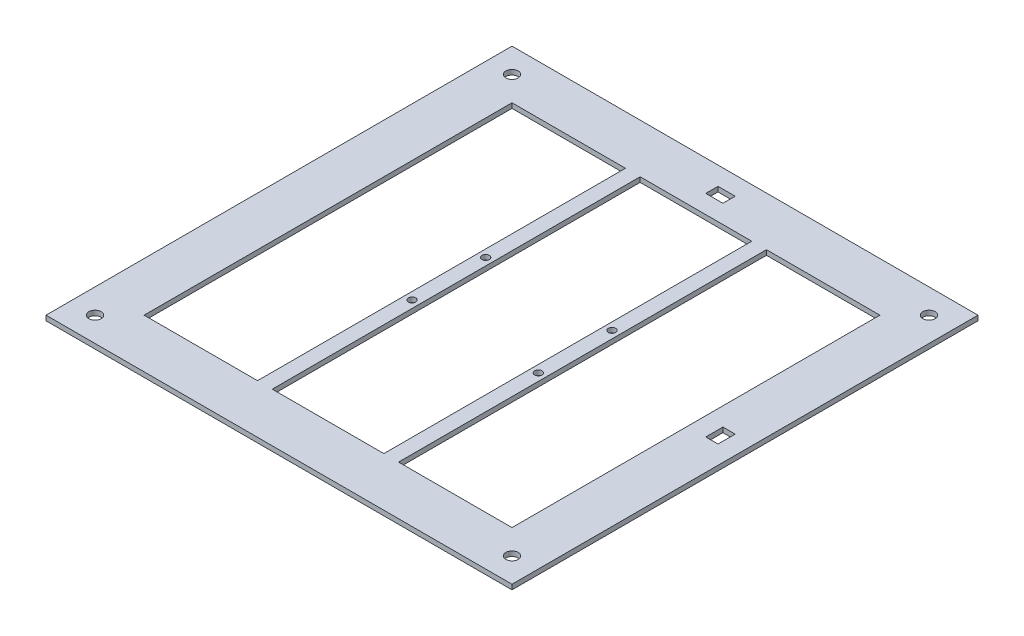
ISO-10303-21;
HEADER;
FILE_DESCRIPTION(('STEP AP214'),'2;1');
FILE_NAME('part.step','',(''),(''),'','','');
FILE_SCHEMA(('AUTOMOTIVE_DESIGN { 1 0 10303 214 1 1 1 1 }'));
ENDSEC;
DATA;
#1=APPLICATION_CONTEXT('core data for automotive mechanical design processes');
#2=APPLICATION_PROTOCOL_DEFINITION('international standard','automotive_design',2000,#1);
#3=PRODUCT_CONTEXT('',#1,'mechanical');
#4=PRODUCT('Part','Part','',(#3));
#5=PRODUCT_RELATED_PRODUCT_CATEGORY('part','',(#4));
#6=PRODUCT_DEFINITION_FORMATION('','',#4);
#7=PRODUCT_DEFINITION_CONTEXT('part definition',#1,'design');
#8=PRODUCT_DEFINITION('design','',#6,#7);
#9=PRODUCT_DEFINITION_SHAPE('','',#8);
#10=(LENGTH_UNIT() NAMED_UNIT(*) SI_UNIT(.MILLI.,.METRE.));
#11=(NAMED_UNIT(*) PLANE_ANGLE_UNIT() SI_UNIT($,.RADIAN.));
#12=(NAMED_UNIT(*) SI_UNIT($,.STERADIAN.) SOLID_ANGLE_UNIT());
#13=UNCERTAINTY_MEASURE_WITH_UNIT(LENGTH_MEASURE(1.E-05),#10,'distance_accuracy_value','');
#14=(GEOMETRIC_REPRESENTATION_CONTEXT(3) GLOBAL_UNCERTAINTY_ASSIGNED_CONTEXT((#13)) GLOBAL_UNIT_ASSIGNED_CONTEXT((#10,
#11,#12)) REPRESENTATION_CONTEXT('',''));
#15=CARTESIAN_POINT('',(0.,0.,0.));
#16=DIRECTION('',(0.,0.,1.));
#17=DIRECTION('',(1.,0.,0.));
#18=AXIS2_PLACEMENT_3D('',#15,#16,#17);
#19=CARTESIAN_POINT('',(0.,2.,0.));
#20=DIRECTION('',(0.,1.,0.));
#21=DIRECTION('',(0.,0.,1.));
#22=AXIS2_PLACEMENT_3D('',#19,#20,#21);
#23=PLANE('',#22);
#24=CARTESIAN_POINT('',(170.,2.,0.));
#25=DIRECTION('',(0.,1.,0.));
#26=DIRECTION('',(0.,0.,-1.));
#27=AXIS2_PLACEMENT_3D('',#24,#25,#26);
#28=CIRCLE('',#27,2.50000000000002);
#29=CARTESIAN_POINT('',(170.,2.,-2.50000000000002));
#30=VERTEX_POINT('',#29);
#31=EDGE_CURVE('E310',#30,#30,#28,.T.);
#32=ORIENTED_EDGE('',*,*,#31,.F.);
#33=EDGE_LOOP('',(#32));
#34=FACE_BOUND('',#33,.T.);
#35=CARTESIAN_POINT('',(110.75,2.,-100.));
#36=DIRECTION('',(0.,1.,0.));
#37=DIRECTION('',(0.,0.,-1.));
#38=AXIS2_PLACEMENT_3D('',#35,#36,#37);
#39=CIRCLE('',#38,1.5);
#40=CARTESIAN_POINT('',(110.75,2.,-101.5));
#41=VERTEX_POINT('',#40);
#42=EDGE_CURVE('E311',#41,#41,#39,.T.);
#43=ORIENTED_EDGE('',*,*,#42,.F.);
#44=EDGE_LOOP('',(#43));
#45=FACE_BOUND('',#44,.T.);
#46=CARTESIAN_POINT('',(0.,2.,-170.));
#47=DIRECTION('',(0.,1.,0.));
#48=DIRECTION('',(0.,0.,1.));
#49=AXIS2_PLACEMENT_3D('',#46,#47,#48);
#50=CIRCLE('',#49,2.5);
#51=CARTESIAN_POINT('',(0.,2.,-167.5));
#52=VERTEX_POINT('',#51);
#53=EDGE_CURVE('E324',#52,#52,#50,.T.);
#54=ORIENTED_EDGE('',*,*,#53,.F.);
#55=EDGE_LOOP('',(#54));
#56=FACE_BOUND('',#55,.T.);
#57=CARTESIAN_POINT('',(59.25,2.,-100.));
#58=DIRECTION('',(0.,1.,0.));
#59=DIRECTION('',(0.,0.,1.));
#60=AXIS2_PLACEMENT_3D('',#57,#58,#59);
#61=CIRCLE('',#60,1.5);
#62=CARTESIAN_POINT('',(59.25,2.,-98.5));
#63=VERTEX_POINT('',#62);
#64=EDGE_CURVE('E403',#63,#63,#61,.T.);
#65=ORIENTED_EDGE('',*,*,#64,.F.);
#66=EDGE_LOOP('',(#65));
#67=FACE_BOUND('',#66,.T.);
#68=DIRECTION('',(1.,0.,0.));
#69=VECTOR('',#68,1.);
#70=CARTESIAN_POINT('',(-10.,2.,10.));
#71=LINE('',#70,#69);
#72=CARTESIAN_POINT('',(-10.,2.,10.));
#73=VERTEX_POINT('',#72);
#74=CARTESIAN_POINT('',(180.,2.,10.));
#75=VERTEX_POINT('',#74);
#76=EDGE_CURVE('E465',#73,#75,#71,.T.);
#77=ORIENTED_EDGE('',*,*,#76,.T.);
#78=DIRECTION('',(0.,0.,-1.));
#79=VECTOR('',#78,1.);
#80=CARTESIAN_POINT('',(180.,2.,10.));
#81=LINE('',#80,#79);
#82=CARTESIAN_POINT('',(180.,2.,-180.));
#83=VERTEX_POINT('',#82);
#84=EDGE_CURVE('E470',#75,#83,#81,.T.);
#85=ORIENTED_EDGE('',*,*,#84,.T.);
#86=DIRECTION('',(-1.,0.,0.));
#87=VECTOR('',#86,1.);
#88=CARTESIAN_POINT('',(-10.,2.,-180.));
#89=LINE('',#88,#87);
#90=CARTESIAN_POINT('',(-10.,2.,-180.));
#91=VERTEX_POINT('',#90);
#92=EDGE_CURVE('E477',#83,#91,#89,.T.);
#93=ORIENTED_EDGE('',*,*,#92,.T.);
#94=DIRECTION('',(0.,0.,1.));
#95=VECTOR('',#94,1.);
#96=CARTESIAN_POINT('',(-10.,2.,10.));
#97=LINE('',#96,#95);
#98=EDGE_CURVE('E480',#91,#73,#97,.T.);
#99=ORIENTED_EDGE('',*,*,#98,.T.);
#100=EDGE_LOOP('',(#77,#85,#93,#99));
#101=FACE_BOUND('',#100,.T.);
#102=DIRECTION('',(0.,0.,-1.));
#103=VECTOR('',#102,1.);
#104=CARTESIAN_POINT('',(56.25,2.,-160.));
#105=LINE('',#104,#103);
#106=CARTESIAN_POINT('',(56.25,2.,-10.));
#107=VERTEX_POINT('',#106);
#108=CARTESIAN_POINT('',(56.25,2.,-160.));
#109=VERTEX_POINT('',#108);
#110=EDGE_CURVE('E427',#107,#109,#105,.T.);
#111=ORIENTED_EDGE('',*,*,#110,.F.);
#112=DIRECTION('',(1.,0.,0.));
#113=VECTOR('',#112,1.);
#114=CARTESIAN_POINT('',(10.,2.,-10.));
#115=LINE('',#114,#113);
#116=CARTESIAN_POINT('',(10.,2.,-10.));
#117=VERTEX_POINT('',#116);
#118=EDGE_CURVE('E423',#117,#107,#115,.T.);
#119=ORIENTED_EDGE('',*,*,#118,.F.);
#120=DIRECTION('',(0.,0.,1.));
#121=VECTOR('',#120,1.);
#122=CARTESIAN_POINT('',(10.,2.,-10.));
#123=LINE('',#122,#121);
#124=CARTESIAN_POINT('',(10.,2.,-160.));
#125=VERTEX_POINT('',#124);
#126=EDGE_CURVE('E438',#125,#117,#123,.T.);
#127=ORIENTED_EDGE('',*,*,#126,.F.);
#128=DIRECTION('',(-1.,0.,0.));
#129=VECTOR('',#128,1.);
#130=CARTESIAN_POINT('',(10.,2.,-160.));
#131=LINE('',#130,#129);
#132=EDGE_CURVE('E443',#109,#125,#131,.T.);
#133=ORIENTED_EDGE('',*,*,#132,.F.);
#134=EDGE_LOOP('',(#111,#119,#127,#133));
#135=FACE_BOUND('',#134,.T.);
#136=DIRECTION('',(0.,0.,1.));
#137=VECTOR('',#136,1.);
#138=CARTESIAN_POINT('',(113.75,2.,-160.));
#139=LINE('',#138,#137);
#140=CARTESIAN_POINT('',(113.75,2.,-160.));
#141=VERTEX_POINT('',#140);
#142=CARTESIAN_POINT('',(113.75,2.,-10.));
#143=VERTEX_POINT('',#142);
#144=EDGE_CURVE('E392',#141,#143,#139,.T.);
#145=ORIENTED_EDGE('',*,*,#144,.F.);
#146=DIRECTION('',(-1.,0.,0.));
#147=VECTOR('',#146,1.);
#148=CARTESIAN_POINT('',(113.75,2.,-160.));
#149=LINE('',#148,#147);
#150=CARTESIAN_POINT('',(160.,2.,-160.));
#151=VERTEX_POINT('',#150);
#152=EDGE_CURVE('E412',#151,#141,#149,.T.);
#153=ORIENTED_EDGE('',*,*,#152,.F.);
#154=DIRECTION('',(0.,0.,-1.));
#155=VECTOR('',#154,1.);
#156=CARTESIAN_POINT('',(160.,2.,-10.));
#157=LINE('',#156,#155);
#158=CARTESIAN_POINT('',(160.,2.,-10.));
#159=VERTEX_POINT('',#158);
#160=EDGE_CURVE('E391',#159,#151,#157,.T.);
#161=ORIENTED_EDGE('',*,*,#160,.F.);
#162=DIRECTION('',(1.,0.,0.));
#163=VECTOR('',#162,1.);
#164=CARTESIAN_POINT('',(113.75,2.,-10.));
#165=LINE('',#164,#163);
#166=EDGE_CURVE('E386',#143,#159,#165,.T.);
#167=ORIENTED_EDGE('',*,*,#166,.F.);
#168=EDGE_LOOP('',(#145,#153,#161,#167));
#169=FACE_BOUND('',#168,.T.);
#170=CARTESIAN_POINT('',(59.25,2.,-70.));
#171=DIRECTION('',(0.,1.,0.));
#172=DIRECTION('',(0.,0.,1.));
#173=AXIS2_PLACEMENT_3D('',#170,#171,#172);
#174=CIRCLE('',#173,1.50000000000001);
#175=CARTESIAN_POINT('',(59.25,2.,-68.5));
#176=VERTEX_POINT('',#175);
#177=EDGE_CURVE('E375',#176,#176,#174,.T.);
#178=ORIENTED_EDGE('',*,*,#177,.F.);
#179=EDGE_LOOP('',(#178));
#180=FACE_BOUND('',#179,.T.);
#181=DIRECTION('',(0.,0.,-1.));
#182=VECTOR('',#181,1.);
#183=CARTESIAN_POINT('',(107.75,2.,-160.));
#184=LINE('',#183,#182);
#185=CARTESIAN_POINT('',(107.75,2.,-10.));
#186=VERTEX_POINT('',#185);
#187=CARTESIAN_POINT('',(107.75,2.,-160.));
#188=VERTEX_POINT('',#187);
#189=EDGE_CURVE('E339',#186,#188,#184,.T.);
#190=ORIENTED_EDGE('',*,*,#189,.F.);
#191=DIRECTION('',(1.,0.,0.));
#192=VECTOR('',#191,1.);
#193=CARTESIAN_POINT('',(62.25,2.,-10.));
#194=LINE('',#193,#192);
#195=CARTESIAN_POINT('',(62.25,2.,-10.));
#196=VERTEX_POINT('',#195);
#197=EDGE_CURVE('E335',#196,#186,#194,.T.);
#198=ORIENTED_EDGE('',*,*,#197,.F.);
#199=DIRECTION('',(0.,0.,1.));
#200=VECTOR('',#199,1.);
#201=CARTESIAN_POINT('',(62.25,2.,-160.));
#202=LINE('',#201,#200);
#203=CARTESIAN_POINT('',(62.25,2.,-160.));
#204=VERTEX_POINT('',#203);
#205=EDGE_CURVE('E348',#204,#196,#202,.T.);
#206=ORIENTED_EDGE('',*,*,#205,.F.);
#207=DIRECTION('',(-1.,0.,0.));
#208=VECTOR('',#207,1.);
#209=CARTESIAN_POINT('',(62.25,2.,-160.));
#210=LINE('',#209,#208);
#211=EDGE_CURVE('E353',#188,#204,#210,.T.);
#212=ORIENTED_EDGE('',*,*,#211,.F.);
#213=EDGE_LOOP('',(#190,#198,#206,#212));
#214=FACE_BOUND('',#213,.T.);
#215=CARTESIAN_POINT('',(0.,2.,0.));
#216=DIRECTION('',(0.,1.,0.));
#217=DIRECTION('',(0.,0.,1.));
#218=AXIS2_PLACEMENT_3D('',#215,#216,#217);
#219=CIRCLE('',#218,2.5);
#220=CARTESIAN_POINT('',(0.,2.,2.5));
#221=VERTEX_POINT('',#220);
#222=EDGE_CURVE('E334',#221,#221,#219,.T.);
#223=ORIENTED_EDGE('',*,*,#222,.F.);
#224=EDGE_LOOP('',(#223));
#225=FACE_BOUND('',#224,.T.);
#226=CARTESIAN_POINT('',(110.75,2.,-70.));
#227=DIRECTION('',(0.,1.,0.));
#228=DIRECTION('',(0.,0.,-1.));
#229=AXIS2_PLACEMENT_3D('',#226,#227,#228);
#230=CIRCLE('',#229,1.5);
#231=CARTESIAN_POINT('',(110.75,2.,-71.5));
#232=VERTEX_POINT('',#231);
#233=EDGE_CURVE('E300',#232,#232,#230,.T.);
#234=ORIENTED_EDGE('',*,*,#233,.F.);
#235=EDGE_LOOP('',(#234));
#236=FACE_BOUND('',#235,.T.);
#237=CARTESIAN_POINT('',(170.,2.,-170.));
#238=DIRECTION('',(0.,1.,0.));
#239=DIRECTION('',(0.,0.,-1.));
#240=AXIS2_PLACEMENT_3D('',#237,#238,#239);
#241=CIRCLE('',#240,2.50000000000002);
#242=CARTESIAN_POINT('',(170.,2.,-172.5));
#243=VERTEX_POINT('',#242);
#244=EDGE_CURVE('E288',#243,#243,#241,.T.);
#245=ORIENTED_EDGE('',*,*,#244,.F.);
#246=EDGE_LOOP('',(#245));
#247=FACE_BOUND('',#246,.T.);
#248=DIRECTION('',(-1.,0.,0.));
#249=VECTOR('',#248,1.);
#250=CARTESIAN_POINT('',(167.5,2.,-88.5));
#251=LINE('',#250,#249);
#252=CARTESIAN_POINT('',(172.5,2.,-88.5));
#253=VERTEX_POINT('',#252);
#254=CARTESIAN_POINT('',(167.5,2.,-88.5));
#255=VERTEX_POINT('',#254);
#256=EDGE_CURVE('E254',#253,#255,#251,.T.);
#257=ORIENTED_EDGE('',*,*,#256,.F.);
#258=DIRECTION('',(0.,0.,-1.));
#259=VECTOR('',#258,1.);
#260=CARTESIAN_POINT('',(172.5,2.,-81.5));
#261=LINE('',#260,#259);
#262=CARTESIAN_POINT('',(172.5,2.,-81.5));
#263=VERTEX_POINT('',#262);
#264=EDGE_CURVE('E250',#263,#253,#261,.T.);
#265=ORIENTED_EDGE('',*,*,#264,.F.);
#266=DIRECTION('',(1.,0.,0.));
#267=VECTOR('',#266,1.);
#268=CARTESIAN_POINT('',(167.5,2.,-81.5));
#269=LINE('',#268,#267);
#270=CARTESIAN_POINT('',(167.5,2.,-81.5));
#271=VERTEX_POINT('',#270);
#272=EDGE_CURVE('E261',#271,#263,#269,.T.);
#273=ORIENTED_EDGE('',*,*,#272,.F.);
#274=DIRECTION('',(0.,0.,1.));
#275=VECTOR('',#274,1.);
#276=CARTESIAN_POINT('',(167.5,2.,-81.5));
#277=LINE('',#276,#275);
#278=EDGE_CURVE('E266',#255,#271,#277,.T.);
#279=ORIENTED_EDGE('',*,*,#278,.F.);
#280=EDGE_LOOP('',(#257,#265,#273,#279));
#281=FACE_BOUND('',#280,.T.);
#282=DIRECTION('',(-1.,0.,0.));
#283=VECTOR('',#282,1.);
#284=CARTESIAN_POINT('',(81.5,2.,-172.5));
#285=LINE('',#284,#283);
#286=CARTESIAN_POINT('',(88.5,2.,-172.5));
#287=VERTEX_POINT('',#286);
#288=CARTESIAN_POINT('',(81.5,2.,-172.5));
#289=VERTEX_POINT('',#288);
#290=EDGE_CURVE('E210',#287,#289,#285,.T.);
#291=ORIENTED_EDGE('',*,*,#290,.F.);
#292=DIRECTION('',(0.,0.,-1.));
#293=VECTOR('',#292,1.);
#294=CARTESIAN_POINT('',(88.5,2.,-172.5));
#295=LINE('',#294,#293);
#296=CARTESIAN_POINT('',(88.5,2.,-167.5));
#297=VERTEX_POINT('',#296);
#298=EDGE_CURVE('E201',#297,#287,#295,.T.);
#299=ORIENTED_EDGE('',*,*,#298,.F.);
#300=DIRECTION('',(1.,0.,0.));
#301=VECTOR('',#300,1.);
#302=CARTESIAN_POINT('',(81.5,2.,-167.5));
#303=LINE('',#302,#301);
#304=CARTESIAN_POINT('',(81.5,2.,-167.5));
#305=VERTEX_POINT('',#304);
#306=EDGE_CURVE('E227',#305,#297,#303,.T.);
#307=ORIENTED_EDGE('',*,*,#306,.F.);
#308=DIRECTION('',(0.,0.,1.));
#309=VECTOR('',#308,1.);
#310=CARTESIAN_POINT('',(81.5,2.,-172.5));
#311=LINE('',#310,#309);
#312=EDGE_CURVE('E222',#289,#305,#311,.T.);
#313=ORIENTED_EDGE('',*,*,#312,.F.);
#314=EDGE_LOOP('',(#291,#299,#307,#313));
#315=FACE_BOUND('',#314,.T.);
#316=ADVANCED_FACE('F40',(#34,#45,#56,#67,#101,#135,#169,#180,#214,#225,#236,#247,#281,#315),
#23,.T.);
#317=CARTESIAN_POINT('',(0.,0.,0.));
#318=DIRECTION('',(0.,1.,0.));
#319=DIRECTION('',(0.,0.,1.));
#320=AXIS2_PLACEMENT_3D('',#317,#318,#319);
#321=PLANE('',#320);
#322=DIRECTION('',(0.,0.,-1.));
#323=VECTOR('',#322,1.);
#324=CARTESIAN_POINT('',(172.5,0.,-81.5));
#325=LINE('',#324,#323);
#326=CARTESIAN_POINT('',(172.5,0.,-81.5));
#327=VERTEX_POINT('',#326);
#328=CARTESIAN_POINT('',(172.5,0.,-88.5));
#329=VERTEX_POINT('',#328);
#330=EDGE_CURVE('E218',#327,#329,#325,.T.);
#331=ORIENTED_EDGE('',*,*,#330,.T.);
#332=DIRECTION('',(-1.,0.,0.));
#333=VECTOR('',#332,1.);
#334=CARTESIAN_POINT('',(167.5,0.,-88.5));
#335=LINE('',#334,#333);
#336=CARTESIAN_POINT('',(167.5,0.,-88.5));
#337=VERTEX_POINT('',#336);
#338=EDGE_CURVE('E270',#329,#337,#335,.T.);
#339=ORIENTED_EDGE('',*,*,#338,.T.);
#340=DIRECTION('',(0.,0.,1.));
#341=VECTOR('',#340,1.);
#342=CARTESIAN_POINT('',(167.5,0.,-81.5));
#343=LINE('',#342,#341);
#344=CARTESIAN_POINT('',(167.5,0.,-81.5));
#345=VERTEX_POINT('',#344);
#346=EDGE_CURVE('E273',#337,#345,#343,.T.);
#347=ORIENTED_EDGE('',*,*,#346,.T.);
#348=DIRECTION('',(1.,0.,0.));
#349=VECTOR('',#348,1.);
#350=CARTESIAN_POINT('',(167.5,0.,-81.5));
#351=LINE('',#350,#349);
#352=EDGE_CURVE('E255',#345,#327,#351,.T.);
#353=ORIENTED_EDGE('',*,*,#352,.T.);
#354=EDGE_LOOP('',(#331,#339,#347,#353));
#355=FACE_BOUND('',#354,.T.);
#356=CARTESIAN_POINT('',(59.25,0.,-70.));
#357=DIRECTION('',(0.,1.,0.));
#358=DIRECTION('',(0.,0.,1.));
#359=AXIS2_PLACEMENT_3D('',#356,#357,#358);
#360=CIRCLE('',#359,1.50000000000001);
#361=CARTESIAN_POINT('',(59.25,0.,-68.5));
#362=VERTEX_POINT('',#361);
#363=EDGE_CURVE('E374',#362,#362,#360,.T.);
#364=ORIENTED_EDGE('',*,*,#363,.T.);
#365=EDGE_LOOP('',(#364));
#366=FACE_BOUND('',#365,.T.);
#367=CARTESIAN_POINT('',(59.25,0.,-100.));
#368=DIRECTION('',(0.,1.,0.));
#369=DIRECTION('',(0.,0.,1.));
#370=AXIS2_PLACEMENT_3D('',#367,#368,#369);
#371=CIRCLE('',#370,1.5);
#372=CARTESIAN_POINT('',(59.25,0.,-98.5));
#373=VERTEX_POINT('',#372);
#374=EDGE_CURVE('E380',#373,#373,#371,.T.);
#375=ORIENTED_EDGE('',*,*,#374,.T.);
#376=EDGE_LOOP('',(#375));
#377=FACE_BOUND('',#376,.T.);
#378=DIRECTION('',(-1.,0.,0.));
#379=VECTOR('',#378,1.);
#380=CARTESIAN_POINT('',(113.75,0.,-160.));
#381=LINE('',#380,#379);
#382=CARTESIAN_POINT('',(160.,0.,-160.));
#383=VERTEX_POINT('',#382);
#384=CARTESIAN_POINT('',(113.75,0.,-160.));
#385=VERTEX_POINT('',#384);
#386=EDGE_CURVE('E399',#383,#385,#381,.T.);
#387=ORIENTED_EDGE('',*,*,#386,.T.);
#388=DIRECTION('',(0.,0.,1.));
#389=VECTOR('',#388,1.);
#390=CARTESIAN_POINT('',(113.75,0.,-160.));
#391=LINE('',#390,#389);
#392=CARTESIAN_POINT('',(113.75,0.,-10.));
#393=VERTEX_POINT('',#392);
#394=EDGE_CURVE('E402',#385,#393,#391,.T.);
#395=ORIENTED_EDGE('',*,*,#394,.T.);
#396=DIRECTION('',(1.,0.,0.));
#397=VECTOR('',#396,1.);
#398=CARTESIAN_POINT('',(113.75,0.,-10.));
#399=LINE('',#398,#397);
#400=CARTESIAN_POINT('',(160.,0.,-10.));
#401=VERTEX_POINT('',#400);
#402=EDGE_CURVE('E406',#393,#401,#399,.T.);
#403=ORIENTED_EDGE('',*,*,#402,.T.);
#404=DIRECTION('',(0.,0.,-1.));
#405=VECTOR('',#404,1.);
#406=CARTESIAN_POINT('',(160.,0.,-10.));
#407=LINE('',#406,#405);
#408=EDGE_CURVE('E409',#401,#383,#407,.T.);
#409=ORIENTED_EDGE('',*,*,#408,.T.);
#410=EDGE_LOOP('',(#387,#395,#403,#409));
#411=FACE_BOUND('',#410,.T.);
#412=DIRECTION('',(1.,0.,0.));
#413=VECTOR('',#412,1.);
#414=CARTESIAN_POINT('',(-10.,0.,10.));
#415=LINE('',#414,#413);
#416=CARTESIAN_POINT('',(-10.,0.,10.));
#417=VERTEX_POINT('',#416);
#418=CARTESIAN_POINT('',(180.,0.,10.));
#419=VERTEX_POINT('',#418);
#420=EDGE_CURVE('E464',#417,#419,#415,.T.);
#421=ORIENTED_EDGE('',*,*,#420,.F.);
#422=DIRECTION('',(0.,0.,1.));
#423=VECTOR('',#422,1.);
#424=CARTESIAN_POINT('',(-10.,0.,10.));
#425=LINE('',#424,#423);
#426=CARTESIAN_POINT('',(-10.,0.,-180.));
#427=VERTEX_POINT('',#426);
#428=EDGE_CURVE('E471',#427,#417,#425,.T.);
#429=ORIENTED_EDGE('',*,*,#428,.F.);
#430=DIRECTION('',(-1.,0.,0.));
#431=VECTOR('',#430,1.);
#432=CARTESIAN_POINT('',(-10.,0.,-180.));
#433=LINE('',#432,#431);
#434=CARTESIAN_POINT('',(180.,0.,-180.));
#435=VERTEX_POINT('',#434);
#436=EDGE_CURVE('E489',#435,#427,#433,.T.);
#437=ORIENTED_EDGE('',*,*,#436,.F.);
#438=DIRECTION('',(0.,0.,-1.));
#439=VECTOR('',#438,1.);
#440=CARTESIAN_POINT('',(180.,0.,10.));
#441=LINE('',#440,#439);
#442=EDGE_CURVE('E487',#419,#435,#441,.T.);
#443=ORIENTED_EDGE('',*,*,#442,.F.);
#444=EDGE_LOOP('',(#421,#429,#437,#443));
#445=FACE_BOUND('',#444,.T.);
#446=DIRECTION('',(1.,0.,0.));
#447=VECTOR('',#446,1.);
#448=CARTESIAN_POINT('',(10.,0.,-10.));
#449=LINE('',#448,#447);
#450=CARTESIAN_POINT('',(10.,0.,-10.));
#451=VERTEX_POINT('',#450);
#452=CARTESIAN_POINT('',(56.25,0.,-10.));
#453=VERTEX_POINT('',#452);
#454=EDGE_CURVE('E422',#451,#453,#449,.T.);
#455=ORIENTED_EDGE('',*,*,#454,.T.);
#456=DIRECTION('',(0.,0.,-1.));
#457=VECTOR('',#456,1.);
#458=CARTESIAN_POINT('',(56.25,0.,-160.));
#459=LINE('',#458,#457);
#460=CARTESIAN_POINT('',(56.25,0.,-160.));
#461=VERTEX_POINT('',#460);
#462=EDGE_CURVE('E447',#453,#461,#459,.T.);
#463=ORIENTED_EDGE('',*,*,#462,.T.);
#464=DIRECTION('',(-1.,0.,0.));
#465=VECTOR('',#464,1.);
#466=CARTESIAN_POINT('',(10.,0.,-160.));
#467=LINE('',#466,#465);
#468=CARTESIAN_POINT('',(10.,0.,-160.));
#469=VERTEX_POINT('',#468);
#470=EDGE_CURVE('E450',#461,#469,#467,.T.);
#471=ORIENTED_EDGE('',*,*,#470,.T.);
#472=DIRECTION('',(0.,0.,1.));
#473=VECTOR('',#472,1.);
#474=CARTESIAN_POINT('',(10.,0.,-10.));
#475=LINE('',#474,#473);
#476=EDGE_CURVE('E428',#469,#451,#475,.T.);
#477=ORIENTED_EDGE('',*,*,#476,.T.);
#478=EDGE_LOOP('',(#455,#463,#471,#477));
#479=FACE_BOUND('',#478,.T.);
#480=DIRECTION('',(1.,0.,0.));
#481=VECTOR('',#480,1.);
#482=CARTESIAN_POINT('',(62.25,0.,-10.));
#483=LINE('',#482,#481);
#484=CARTESIAN_POINT('',(62.25,0.,-10.));
#485=VERTEX_POINT('',#484);
#486=CARTESIAN_POINT('',(107.75,0.,-10.));
#487=VERTEX_POINT('',#486);
#488=EDGE_CURVE('E330',#485,#487,#483,.T.);
#489=ORIENTED_EDGE('',*,*,#488,.T.);
#490=DIRECTION('',(0.,0.,-1.));
#491=VECTOR('',#490,1.);
#492=CARTESIAN_POINT('',(107.75,0.,-160.));
#493=LINE('',#492,#491);
#494=CARTESIAN_POINT('',(107.75,0.,-160.));
#495=VERTEX_POINT('',#494);
#496=EDGE_CURVE('E357',#487,#495,#493,.T.);
#497=ORIENTED_EDGE('',*,*,#496,.T.);
#498=DIRECTION('',(-1.,0.,0.));
#499=VECTOR('',#498,1.);
#500=CARTESIAN_POINT('',(62.25,0.,-160.));
#501=LINE('',#500,#499);
#502=CARTESIAN_POINT('',(62.25,0.,-160.));
#503=VERTEX_POINT('',#502);
#504=EDGE_CURVE('E360',#495,#503,#501,.T.);
#505=ORIENTED_EDGE('',*,*,#504,.T.);
#506=DIRECTION('',(0.,0.,1.));
#507=VECTOR('',#506,1.);
#508=CARTESIAN_POINT('',(62.25,0.,-160.));
#509=LINE('',#508,#507);
#510=EDGE_CURVE('E340',#503,#485,#509,.T.);
#511=ORIENTED_EDGE('',*,*,#510,.T.);
#512=EDGE_LOOP('',(#489,#497,#505,#511));
#513=FACE_BOUND('',#512,.T.);
#514=CARTESIAN_POINT('',(0.,0.,-170.));
#515=DIRECTION('',(0.,1.,0.));
#516=DIRECTION('',(0.,0.,1.));
#517=AXIS2_PLACEMENT_3D('',#514,#515,#516);
#518=CIRCLE('',#517,2.5);
#519=CARTESIAN_POINT('',(0.,0.,-167.5));
#520=VERTEX_POINT('',#519);
#521=EDGE_CURVE('E331',#520,#520,#518,.T.);
#522=ORIENTED_EDGE('',*,*,#521,.T.);
#523=EDGE_LOOP('',(#522));
#524=FACE_BOUND('',#523,.T.);
#525=CARTESIAN_POINT('',(0.,0.,0.));
#526=DIRECTION('',(0.,1.,0.));
#527=DIRECTION('',(0.,0.,1.));
#528=AXIS2_PLACEMENT_3D('',#525,#526,#527);
#529=CIRCLE('',#528,2.5);
#530=CARTESIAN_POINT('',(0.,0.,2.5));
#531=VERTEX_POINT('',#530);
#532=EDGE_CURVE('E316',#531,#531,#529,.T.);
#533=ORIENTED_EDGE('',*,*,#532,.T.);
#534=EDGE_LOOP('',(#533));
#535=FACE_BOUND('',#534,.T.);
#536=CARTESIAN_POINT('',(110.75,0.,-100.));
#537=DIRECTION('',(0.,1.,0.));
#538=DIRECTION('',(0.,0.,-1.));
#539=AXIS2_PLACEMENT_3D('',#536,#537,#538);
#540=CIRCLE('',#539,1.5);
#541=CARTESIAN_POINT('',(110.75,0.,-101.5));
#542=VERTEX_POINT('',#541);
#543=EDGE_CURVE('E306',#542,#542,#540,.T.);
#544=ORIENTED_EDGE('',*,*,#543,.T.);
#545=EDGE_LOOP('',(#544));
#546=FACE_BOUND('',#545,.T.);
#547=CARTESIAN_POINT('',(110.75,0.,-70.));
#548=DIRECTION('',(0.,1.,0.));
#549=DIRECTION('',(0.,0.,-1.));
#550=AXIS2_PLACEMENT_3D('',#547,#548,#549);
#551=CIRCLE('',#550,1.5);
#552=CARTESIAN_POINT('',(110.75,0.,-71.5));
#553=VERTEX_POINT('',#552);
#554=EDGE_CURVE('E307',#553,#553,#551,.T.);
#555=ORIENTED_EDGE('',*,*,#554,.T.);
#556=EDGE_LOOP('',(#555));
#557=FACE_BOUND('',#556,.T.);
#558=CARTESIAN_POINT('',(170.,0.,0.));
#559=DIRECTION('',(0.,1.,0.));
#560=DIRECTION('',(0.,0.,-1.));
#561=AXIS2_PLACEMENT_3D('',#558,#559,#560);
#562=CIRCLE('',#561,2.50000000000002);
#563=CARTESIAN_POINT('',(170.,0.,-2.50000000000002));
#564=VERTEX_POINT('',#563);
#565=EDGE_CURVE('E293',#564,#564,#562,.T.);
#566=ORIENTED_EDGE('',*,*,#565,.T.);
#567=EDGE_LOOP('',(#566));
#568=FACE_BOUND('',#567,.T.);
#569=CARTESIAN_POINT('',(170.,0.,-170.));
#570=DIRECTION('',(0.,1.,0.));
#571=DIRECTION('',(0.,0.,-1.));
#572=AXIS2_PLACEMENT_3D('',#569,#570,#571);
#573=CIRCLE('',#572,2.50000000000002);
#574=CARTESIAN_POINT('',(170.,0.,-172.5));
#575=VERTEX_POINT('',#574);
#576=EDGE_CURVE('E287',#575,#575,#573,.T.);
#577=ORIENTED_EDGE('',*,*,#576,.T.);
#578=EDGE_LOOP('',(#577));
#579=FACE_BOUND('',#578,.T.);
#580=DIRECTION('',(0.,0.,-1.));
#581=VECTOR('',#580,1.);
#582=CARTESIAN_POINT('',(88.5,0.,-172.5));
#583=LINE('',#582,#581);
#584=CARTESIAN_POINT('',(88.5,0.,-167.5));
#585=VERTEX_POINT('',#584);
#586=CARTESIAN_POINT('',(88.5,0.,-172.5));
#587=VERTEX_POINT('',#586);
#588=EDGE_CURVE('E63',#585,#587,#583,.T.);
#589=ORIENTED_EDGE('',*,*,#588,.T.);
#590=DIRECTION('',(-1.,0.,0.));
#591=VECTOR('',#590,1.);
#592=CARTESIAN_POINT('',(81.5,0.,-172.5));
#593=LINE('',#592,#591);
#594=CARTESIAN_POINT('',(81.5,0.,-172.5));
#595=VERTEX_POINT('',#594);
#596=EDGE_CURVE('E217',#587,#595,#593,.T.);
#597=ORIENTED_EDGE('',*,*,#596,.T.);
#598=DIRECTION('',(0.,0.,1.));
#599=VECTOR('',#598,1.);
#600=CARTESIAN_POINT('',(81.5,0.,-172.5));
#601=LINE('',#600,#599);
#602=CARTESIAN_POINT('',(81.5,0.,-167.5));
#603=VERTEX_POINT('',#602);
#604=EDGE_CURVE('E242',#595,#603,#601,.T.);
#605=ORIENTED_EDGE('',*,*,#604,.T.);
#606=DIRECTION('',(1.,0.,0.));
#607=VECTOR('',#606,1.);
#608=CARTESIAN_POINT('',(81.5,0.,-167.5));
#609=LINE('',#608,#607);
#610=EDGE_CURVE('E211',#603,#585,#609,.T.);
#611=ORIENTED_EDGE('',*,*,#610,.T.);
#612=EDGE_LOOP('',(#589,#597,#605,#611));
#613=FACE_BOUND('',#612,.T.);
#614=ADVANCED_FACE('F507',(#355,#366,#377,#411,#445,#479,#513,#524,#535,#546,#557,#568,#579,
#613),#321,.F.);
#615=CARTESIAN_POINT('',(-10.,2.,10.));
#616=DIRECTION('',(0.,0.,-1.));
#617=DIRECTION('',(-1.,0.,0.));
#618=AXIS2_PLACEMENT_3D('',#615,#616,#617);
#619=PLANE('',#618);
#620=ORIENTED_EDGE('',*,*,#420,.T.);
#621=DIRECTION('',(0.,-1.,0.));
#622=VECTOR('',#621,1.);
#623=CARTESIAN_POINT('',(180.,2.,10.));
#624=LINE('',#623,#622);
#625=EDGE_CURVE('E12',#75,#419,#624,.T.);
#626=ORIENTED_EDGE('',*,*,#625,.F.);
#627=ORIENTED_EDGE('',*,*,#76,.F.);
#628=DIRECTION('',(0.,-1.,0.));
#629=VECTOR('',#628,1.);
#630=CARTESIAN_POINT('',(-10.,2.,10.));
#631=LINE('',#630,#629);
#632=EDGE_CURVE('E484',#73,#417,#631,.T.);
#633=ORIENTED_EDGE('',*,*,#632,.T.);
#634=EDGE_LOOP('',(#620,#626,#627,#633));
#635=FACE_BOUND('',#634,.T.);
#636=ADVANCED_FACE('F42',(#635),#619,.F.);
#637=CARTESIAN_POINT('',(180.,2.,10.));
#638=DIRECTION('',(-1.,0.,0.));
#639=DIRECTION('',(0.,0.,1.));
#640=AXIS2_PLACEMENT_3D('',#637,#638,#639);
#641=PLANE('',#640);
#642=ORIENTED_EDGE('',*,*,#442,.T.);
#643=DIRECTION('',(0.,-1.,0.));
#644=VECTOR('',#643,1.);
#645=CARTESIAN_POINT('',(180.,2.,-180.));
#646=LINE('',#645,#644);
#647=EDGE_CURVE('E48',#83,#435,#646,.T.);
#648=ORIENTED_EDGE('',*,*,#647,.F.);
#649=ORIENTED_EDGE('',*,*,#84,.F.);
#650=ORIENTED_EDGE('',*,*,#625,.T.);
#651=EDGE_LOOP('',(#642,#648,#649,#650));
#652=FACE_BOUND('',#651,.T.);
#653=ADVANCED_FACE('F577',(#652),#641,.F.);
#654=CARTESIAN_POINT('',(-10.,2.,-180.));
#655=DIRECTION('',(0.,0.,1.));
#656=DIRECTION('',(1.,0.,0.));
#657=AXIS2_PLACEMENT_3D('',#654,#655,#656);
#658=PLANE('',#657);
#659=ORIENTED_EDGE('',*,*,#436,.T.);
#660=DIRECTION('',(0.,-1.,0.));
#661=VECTOR('',#660,1.);
#662=CARTESIAN_POINT('',(-10.,2.,-180.));
#663=LINE('',#662,#661);
#664=EDGE_CURVE('E494',#91,#427,#663,.T.);
#665=ORIENTED_EDGE('',*,*,#664,.F.);
#666=ORIENTED_EDGE('',*,*,#92,.F.);
#667=ORIENTED_EDGE('',*,*,#647,.T.);
#668=EDGE_LOOP('',(#659,#665,#666,#667));
#669=FACE_BOUND('',#668,.T.);
#670=ADVANCED_FACE('F501',(#669),#658,.F.);
#671=CARTESIAN_POINT('',(-10.,2.,10.));
#672=DIRECTION('',(1.,0.,0.));
#673=DIRECTION('',(0.,0.,-1.));
#674=AXIS2_PLACEMENT_3D('',#671,#672,#673);
#675=PLANE('',#674);
#676=ORIENTED_EDGE('',*,*,#428,.T.);
#677=ORIENTED_EDGE('',*,*,#632,.F.);
#678=ORIENTED_EDGE('',*,*,#98,.F.);
#679=ORIENTED_EDGE('',*,*,#664,.T.);
#680=EDGE_LOOP('',(#676,#677,#678,#679));
#681=FACE_BOUND('',#680,.T.);
#682=ADVANCED_FACE('F511',(#681),#675,.F.);
#683=CARTESIAN_POINT('',(10.,2.,-10.));
#684=DIRECTION('',(0.,0.,-1.));
#685=DIRECTION('',(-1.,0.,0.));
#686=AXIS2_PLACEMENT_3D('',#683,#684,#685);
#687=PLANE('',#686);
#688=ORIENTED_EDGE('',*,*,#454,.F.);
#689=DIRECTION('',(0.,-1.,0.));
#690=VECTOR('',#689,1.);
#691=CARTESIAN_POINT('',(10.,2.,-10.));
#692=LINE('',#691,#690);
#693=EDGE_CURVE('E442',#117,#451,#692,.T.);
#694=ORIENTED_EDGE('',*,*,#693,.F.);
#695=ORIENTED_EDGE('',*,*,#118,.T.);
#696=DIRECTION('',(0.,-1.,0.));
#697=VECTOR('',#696,1.);
#698=CARTESIAN_POINT('',(56.25,2.,-10.));
#699=LINE('',#698,#697);
#700=EDGE_CURVE('E461',#107,#453,#699,.T.);
#701=ORIENTED_EDGE('',*,*,#700,.T.);
#702=EDGE_LOOP('',(#688,#694,#695,#701));
#703=FACE_BOUND('',#702,.T.);
#704=ADVANCED_FACE('F571',(#703),#687,.T.);
#705=CARTESIAN_POINT('',(56.25,2.,-160.));
#706=DIRECTION('',(-1.,0.,0.));
#707=DIRECTION('',(0.,0.,1.));
#708=AXIS2_PLACEMENT_3D('',#705,#706,#707);
#709=PLANE('',#708);
#710=ORIENTED_EDGE('',*,*,#462,.F.);
#711=ORIENTED_EDGE('',*,*,#700,.F.);
#712=ORIENTED_EDGE('',*,*,#110,.T.);
#713=DIRECTION('',(0.,-1.,0.));
#714=VECTOR('',#713,1.);
#715=CARTESIAN_POINT('',(56.25,2.,-160.));
#716=LINE('',#715,#714);
#717=EDGE_CURVE('E459',#109,#461,#716,.T.);
#718=ORIENTED_EDGE('',*,*,#717,.T.);
#719=EDGE_LOOP('',(#710,#711,#712,#718));
#720=FACE_BOUND('',#719,.T.);
#721=ADVANCED_FACE('F618',(#720),#709,.T.);
#722=CARTESIAN_POINT('',(10.,2.,-160.));
#723=DIRECTION('',(0.,0.,1.));
#724=DIRECTION('',(1.,0.,0.));
#725=AXIS2_PLACEMENT_3D('',#722,#723,#724);
#726=PLANE('',#725);
#727=ORIENTED_EDGE('',*,*,#470,.F.);
#728=ORIENTED_EDGE('',*,*,#717,.F.);
#729=ORIENTED_EDGE('',*,*,#132,.T.);
#730=DIRECTION('',(0.,-1.,0.));
#731=VECTOR('',#730,1.);
#732=CARTESIAN_POINT('',(10.,2.,-160.));
#733=LINE('',#732,#731);
#734=EDGE_CURVE('E457',#125,#469,#733,.T.);
#735=ORIENTED_EDGE('',*,*,#734,.T.);
#736=EDGE_LOOP('',(#727,#728,#729,#735));
#737=FACE_BOUND('',#736,.T.);
#738=ADVANCED_FACE('F626',(#737),#726,.T.);
#739=CARTESIAN_POINT('',(10.,2.,-10.));
#740=DIRECTION('',(1.,0.,0.));
#741=DIRECTION('',(0.,0.,-1.));
#742=AXIS2_PLACEMENT_3D('',#739,#740,#741);
#743=PLANE('',#742);
#744=ORIENTED_EDGE('',*,*,#476,.F.);
#745=ORIENTED_EDGE('',*,*,#734,.F.);
#746=ORIENTED_EDGE('',*,*,#126,.T.);
#747=ORIENTED_EDGE('',*,*,#693,.T.);
#748=EDGE_LOOP('',(#744,#745,#746,#747));
#749=FACE_BOUND('',#748,.T.);
#750=ADVANCED_FACE('F634',(#749),#743,.T.);
#751=CARTESIAN_POINT('',(113.75,2.,-160.));
#752=DIRECTION('',(0.,0.,1.));
#753=DIRECTION('',(1.,0.,0.));
#754=AXIS2_PLACEMENT_3D('',#751,#752,#753);
#755=PLANE('',#754);
#756=ORIENTED_EDGE('',*,*,#386,.F.);
#757=DIRECTION('',(0.,-1.,0.));
#758=VECTOR('',#757,1.);
#759=CARTESIAN_POINT('',(160.,2.,-160.));
#760=LINE('',#759,#758);
#761=EDGE_CURVE('E398',#151,#383,#760,.T.);
#762=ORIENTED_EDGE('',*,*,#761,.F.);
#763=ORIENTED_EDGE('',*,*,#152,.T.);
#764=DIRECTION('',(0.,-1.,0.));
#765=VECTOR('',#764,1.);
#766=CARTESIAN_POINT('',(113.75,2.,-160.));
#767=LINE('',#766,#765);
#768=EDGE_CURVE('E419',#141,#385,#767,.T.);
#769=ORIENTED_EDGE('',*,*,#768,.T.);
#770=EDGE_LOOP('',(#756,#762,#763,#769));
#771=FACE_BOUND('',#770,.T.);
#772=ADVANCED_FACE('F643',(#771),#755,.T.);
#773=CARTESIAN_POINT('',(113.75,2.,-160.));
#774=DIRECTION('',(1.,0.,0.));
#775=DIRECTION('',(0.,0.,-1.));
#776=AXIS2_PLACEMENT_3D('',#773,#774,#775);
#777=PLANE('',#776);
#778=ORIENTED_EDGE('',*,*,#394,.F.);
#779=ORIENTED_EDGE('',*,*,#768,.F.);
#780=ORIENTED_EDGE('',*,*,#144,.T.);
#781=DIRECTION('',(0.,-1.,0.));
#782=VECTOR('',#781,1.);
#783=CARTESIAN_POINT('',(113.75,2.,-10.));
#784=LINE('',#783,#782);
#785=EDGE_CURVE('E417',#143,#393,#784,.T.);
#786=ORIENTED_EDGE('',*,*,#785,.T.);
#787=EDGE_LOOP('',(#778,#779,#780,#786));
#788=FACE_BOUND('',#787,.T.);
#789=ADVANCED_FACE('F652',(#788),#777,.T.);
#790=CARTESIAN_POINT('',(113.75,2.,-10.));
#791=DIRECTION('',(0.,0.,-1.));
#792=DIRECTION('',(-1.,0.,0.));
#793=AXIS2_PLACEMENT_3D('',#790,#791,#792);
#794=PLANE('',#793);
#795=ORIENTED_EDGE('',*,*,#402,.F.);
#796=ORIENTED_EDGE('',*,*,#785,.F.);
#797=ORIENTED_EDGE('',*,*,#166,.T.);
#798=DIRECTION('',(0.,-1.,0.));
#799=VECTOR('',#798,1.);
#800=CARTESIAN_POINT('',(160.,2.,-10.));
#801=LINE('',#800,#799);
#802=EDGE_CURVE('E415',#159,#401,#801,.T.);
#803=ORIENTED_EDGE('',*,*,#802,.T.);
#804=EDGE_LOOP('',(#795,#796,#797,#803));
#805=FACE_BOUND('',#804,.T.);
#806=ADVANCED_FACE('F661',(#805),#794,.T.);
#807=CARTESIAN_POINT('',(160.,2.,-10.));
#808=DIRECTION('',(-1.,0.,0.));
#809=DIRECTION('',(0.,0.,1.));
#810=AXIS2_PLACEMENT_3D('',#807,#808,#809);
#811=PLANE('',#810);
#812=ORIENTED_EDGE('',*,*,#408,.F.);
#813=ORIENTED_EDGE('',*,*,#802,.F.);
#814=ORIENTED_EDGE('',*,*,#160,.T.);
#815=ORIENTED_EDGE('',*,*,#761,.T.);
#816=EDGE_LOOP('',(#812,#813,#814,#815));
#817=FACE_BOUND('',#816,.T.);
#818=ADVANCED_FACE('F670',(#817),#811,.T.);
#819=CARTESIAN_POINT('',(59.25,2.,-100.));
#820=DIRECTION('',(0.,-1.,0.));
#821=DIRECTION('',(0.,0.,-1.));
#822=AXIS2_PLACEMENT_3D('',#819,#820,#821);
#823=CYLINDRICAL_SURFACE('',#822,1.5);
#824=ORIENTED_EDGE('',*,*,#64,.T.);
#825=EDGE_LOOP('',(#824));
#826=FACE_BOUND('',#825,.T.);
#827=ORIENTED_EDGE('',*,*,#374,.F.);
#828=EDGE_LOOP('',(#827));
#829=FACE_BOUND('',#828,.T.);
#830=ADVANCED_FACE('F679',(#826,#829),#823,.F.);
#831=CARTESIAN_POINT('',(59.25,2.,-70.));
#832=DIRECTION('',(0.,-1.,0.));
#833=DIRECTION('',(0.,0.,-1.));
#834=AXIS2_PLACEMENT_3D('',#831,#832,#833);
#835=CYLINDRICAL_SURFACE('',#834,1.50000000000001);
#836=ORIENTED_EDGE('',*,*,#177,.T.);
#837=EDGE_LOOP('',(#836));
#838=FACE_BOUND('',#837,.T.);
#839=ORIENTED_EDGE('',*,*,#363,.F.);
#840=EDGE_LOOP('',(#839));
#841=FACE_BOUND('',#840,.T.);
#842=ADVANCED_FACE('F688',(#838,#841),#835,.F.);
#843=CARTESIAN_POINT('',(62.25,2.,-10.));
#844=DIRECTION('',(0.,0.,-1.));
#845=DIRECTION('',(-1.,0.,0.));
#846=AXIS2_PLACEMENT_3D('',#843,#844,#845);
#847=PLANE('',#846);
#848=ORIENTED_EDGE('',*,*,#488,.F.);
#849=DIRECTION('',(0.,-1.,0.));
#850=VECTOR('',#849,1.);
#851=CARTESIAN_POINT('',(62.25,2.,-10.));
#852=LINE('',#851,#850);
#853=EDGE_CURVE('E352',#196,#485,#852,.T.);
#854=ORIENTED_EDGE('',*,*,#853,.F.);
#855=ORIENTED_EDGE('',*,*,#197,.T.);
#856=DIRECTION('',(0.,-1.,0.));
#857=VECTOR('',#856,1.);
#858=CARTESIAN_POINT('',(107.75,2.,-10.));
#859=LINE('',#858,#857);
#860=EDGE_CURVE('E371',#186,#487,#859,.T.);
#861=ORIENTED_EDGE('',*,*,#860,.T.);
#862=EDGE_LOOP('',(#848,#854,#855,#861));
#863=FACE_BOUND('',#862,.T.);
#864=ADVANCED_FACE('F697',(#863),#847,.T.);
#865=CARTESIAN_POINT('',(107.75,2.,-160.));
#866=DIRECTION('',(-1.,0.,0.));
#867=DIRECTION('',(0.,0.,1.));
#868=AXIS2_PLACEMENT_3D('',#865,#866,#867);
#869=PLANE('',#868);
#870=ORIENTED_EDGE('',*,*,#496,.F.);
#871=ORIENTED_EDGE('',*,*,#860,.F.);
#872=ORIENTED_EDGE('',*,*,#189,.T.);
#873=DIRECTION('',(0.,-1.,0.));
#874=VECTOR('',#873,1.);
#875=CARTESIAN_POINT('',(107.75,2.,-160.));
#876=LINE('',#875,#874);
#877=EDGE_CURVE('E369',#188,#495,#876,.T.);
#878=ORIENTED_EDGE('',*,*,#877,.T.);
#879=EDGE_LOOP('',(#870,#871,#872,#878));
#880=FACE_BOUND('',#879,.T.);
#881=ADVANCED_FACE('F706',(#880),#869,.T.);
#882=CARTESIAN_POINT('',(62.25,2.,-160.));
#883=DIRECTION('',(0.,0.,1.));
#884=DIRECTION('',(1.,0.,0.));
#885=AXIS2_PLACEMENT_3D('',#882,#883,#884);
#886=PLANE('',#885);
#887=ORIENTED_EDGE('',*,*,#504,.F.);
#888=ORIENTED_EDGE('',*,*,#877,.F.);
#889=ORIENTED_EDGE('',*,*,#211,.T.);
#890=DIRECTION('',(0.,-1.,0.));
#891=VECTOR('',#890,1.);
#892=CARTESIAN_POINT('',(62.25,2.,-160.));
#893=LINE('',#892,#891);
#894=EDGE_CURVE('E367',#204,#503,#893,.T.);
#895=ORIENTED_EDGE('',*,*,#894,.T.);
#896=EDGE_LOOP('',(#887,#888,#889,#895));
#897=FACE_BOUND('',#896,.T.);
#898=ADVANCED_FACE('F715',(#897),#886,.T.);
#899=CARTESIAN_POINT('',(62.25,2.,-160.));
#900=DIRECTION('',(1.,0.,0.));
#901=DIRECTION('',(0.,0.,-1.));
#902=AXIS2_PLACEMENT_3D('',#899,#900,#901);
#903=PLANE('',#902);
#904=ORIENTED_EDGE('',*,*,#510,.F.);
#905=ORIENTED_EDGE('',*,*,#894,.F.);
#906=ORIENTED_EDGE('',*,*,#205,.T.);
#907=ORIENTED_EDGE('',*,*,#853,.T.);
#908=EDGE_LOOP('',(#904,#905,#906,#907));
#909=FACE_BOUND('',#908,.T.);
#910=ADVANCED_FACE('F724',(#909),#903,.T.);
#911=CARTESIAN_POINT('',(0.,2.,-170.));
#912=DIRECTION('',(0.,-1.,0.));
#913=DIRECTION('',(0.,0.,-1.));
#914=AXIS2_PLACEMENT_3D('',#911,#912,#913);
#915=CYLINDRICAL_SURFACE('',#914,2.5);
#916=ORIENTED_EDGE('',*,*,#53,.T.);
#917=EDGE_LOOP('',(#916));
#918=FACE_BOUND('',#917,.T.);
#919=ORIENTED_EDGE('',*,*,#521,.F.);
#920=EDGE_LOOP('',(#919));
#921=FACE_BOUND('',#920,.T.);
#922=ADVANCED_FACE('F733',(#918,#921),#915,.F.);
#923=CARTESIAN_POINT('',(0.,2.,0.));
#924=DIRECTION('',(0.,-1.,0.));
#925=DIRECTION('',(0.,0.,-1.));
#926=AXIS2_PLACEMENT_3D('',#923,#924,#925);
#927=CYLINDRICAL_SURFACE('',#926,2.5);
#928=ORIENTED_EDGE('',*,*,#222,.T.);
#929=EDGE_LOOP('',(#928));
#930=FACE_BOUND('',#929,.T.);
#931=ORIENTED_EDGE('',*,*,#532,.F.);
#932=EDGE_LOOP('',(#931));
#933=FACE_BOUND('',#932,.T.);
#934=ADVANCED_FACE('F742',(#930,#933),#927,.F.);
#935=CARTESIAN_POINT('',(110.75,2.,-100.));
#936=DIRECTION('',(0.,-1.,0.));
#937=DIRECTION('',(0.,0.,-1.));
#938=AXIS2_PLACEMENT_3D('',#935,#936,#937);
#939=CYLINDRICAL_SURFACE('',#938,1.5);
#940=ORIENTED_EDGE('',*,*,#42,.T.);
#941=EDGE_LOOP('',(#940));
#942=FACE_BOUND('',#941,.T.);
#943=ORIENTED_EDGE('',*,*,#543,.F.);
#944=EDGE_LOOP('',(#943));
#945=FACE_BOUND('',#944,.T.);
#946=ADVANCED_FACE('F751',(#942,#945),#939,.F.);
#947=CARTESIAN_POINT('',(110.75,2.,-70.));
#948=DIRECTION('',(0.,-1.,0.));
#949=DIRECTION('',(0.,0.,-1.));
#950=AXIS2_PLACEMENT_3D('',#947,#948,#949);
#951=CYLINDRICAL_SURFACE('',#950,1.5);
#952=ORIENTED_EDGE('',*,*,#233,.T.);
#953=EDGE_LOOP('',(#952));
#954=FACE_BOUND('',#953,.T.);
#955=ORIENTED_EDGE('',*,*,#554,.F.);
#956=EDGE_LOOP('',(#955));
#957=FACE_BOUND('',#956,.T.);
#958=ADVANCED_FACE('F760',(#954,#957),#951,.F.);
#959=CARTESIAN_POINT('',(170.,2.,0.));
#960=DIRECTION('',(0.,-1.,0.));
#961=DIRECTION('',(0.,0.,-1.));
#962=AXIS2_PLACEMENT_3D('',#959,#960,#961);
#963=CYLINDRICAL_SURFACE('',#962,2.50000000000002);
#964=ORIENTED_EDGE('',*,*,#31,.T.);
#965=EDGE_LOOP('',(#964));
#966=FACE_BOUND('',#965,.T.);
#967=ORIENTED_EDGE('',*,*,#565,.F.);
#968=EDGE_LOOP('',(#967));
#969=FACE_BOUND('',#968,.T.);
#970=ADVANCED_FACE('F769',(#966,#969),#963,.F.);
#971=CARTESIAN_POINT('',(170.,2.,-170.));
#972=DIRECTION('',(0.,-1.,0.));
#973=DIRECTION('',(0.,0.,-1.));
#974=AXIS2_PLACEMENT_3D('',#971,#972,#973);
#975=CYLINDRICAL_SURFACE('',#974,2.50000000000002);
#976=ORIENTED_EDGE('',*,*,#244,.T.);
#977=EDGE_LOOP('',(#976));
#978=FACE_BOUND('',#977,.T.);
#979=ORIENTED_EDGE('',*,*,#576,.F.);
#980=EDGE_LOOP('',(#979));
#981=FACE_BOUND('',#980,.T.);
#982=ADVANCED_FACE('F559',(#978,#981),#975,.F.);
#983=CARTESIAN_POINT('',(172.5,2.,-81.5));
#984=DIRECTION('',(-1.,0.,0.));
#985=DIRECTION('',(0.,0.,1.));
#986=AXIS2_PLACEMENT_3D('',#983,#984,#985);
#987=PLANE('',#986);
#988=ORIENTED_EDGE('',*,*,#330,.F.);
#989=DIRECTION('',(0.,-1.,0.));
#990=VECTOR('',#989,1.);
#991=CARTESIAN_POINT('',(172.5,2.,-81.5));
#992=LINE('',#991,#990);
#993=EDGE_CURVE('E265',#263,#327,#992,.T.);
#994=ORIENTED_EDGE('',*,*,#993,.F.);
#995=ORIENTED_EDGE('',*,*,#264,.T.);
#996=DIRECTION('',(0.,-1.,0.));
#997=VECTOR('',#996,1.);
#998=CARTESIAN_POINT('',(172.5,2.,-88.5));
#999=LINE('',#998,#997);
#1000=EDGE_CURVE('E284',#253,#329,#999,.T.);
#1001=ORIENTED_EDGE('',*,*,#1000,.T.);
#1002=EDGE_LOOP('',(#988,#994,#995,#1001));
#1003=FACE_BOUND('',#1002,.T.);
#1004=ADVANCED_FACE('F546',(#1003),#987,.T.);
#1005=CARTESIAN_POINT('',(167.5,2.,-88.5));
#1006=DIRECTION('',(0.,0.,1.));
#1007=DIRECTION('',(1.,0.,0.));
#1008=AXIS2_PLACEMENT_3D('',#1005,#1006,#1007);
#1009=PLANE('',#1008);
#1010=ORIENTED_EDGE('',*,*,#338,.F.);
#1011=ORIENTED_EDGE('',*,*,#1000,.F.);
#1012=ORIENTED_EDGE('',*,*,#256,.T.);
#1013=DIRECTION('',(0.,-1.,0.));
#1014=VECTOR('',#1013,1.);
#1015=CARTESIAN_POINT('',(167.5,2.,-88.5));
#1016=LINE('',#1015,#1014);
#1017=EDGE_CURVE('E282',#255,#337,#1016,.T.);
#1018=ORIENTED_EDGE('',*,*,#1017,.T.);
#1019=EDGE_LOOP('',(#1010,#1011,#1012,#1018));
#1020=FACE_BOUND('',#1019,.T.);
#1021=ADVANCED_FACE('F551',(#1020),#1009,.T.);
#1022=CARTESIAN_POINT('',(167.5,2.,-81.5));
#1023=DIRECTION('',(1.,0.,0.));
#1024=DIRECTION('',(0.,0.,-1.));
#1025=AXIS2_PLACEMENT_3D('',#1022,#1023,#1024);
#1026=PLANE('',#1025);
#1027=ORIENTED_EDGE('',*,*,#346,.F.);
#1028=ORIENTED_EDGE('',*,*,#1017,.F.);
#1029=ORIENTED_EDGE('',*,*,#278,.T.);
#1030=DIRECTION('',(0.,-1.,0.));
#1031=VECTOR('',#1030,1.);
#1032=CARTESIAN_POINT('',(167.5,2.,-81.5));
#1033=LINE('',#1032,#1031);
#1034=EDGE_CURVE('E280',#271,#345,#1033,.T.);
#1035=ORIENTED_EDGE('',*,*,#1034,.T.);
#1036=EDGE_LOOP('',(#1027,#1028,#1029,#1035));
#1037=FACE_BOUND('',#1036,.T.);
#1038=ADVANCED_FACE('F537',(#1037),#1026,.T.);
#1039=CARTESIAN_POINT('',(167.5,2.,-81.5));
#1040=DIRECTION('',(0.,0.,-1.));
#1041=DIRECTION('',(-1.,0.,0.));
#1042=AXIS2_PLACEMENT_3D('',#1039,#1040,#1041);
#1043=PLANE('',#1042);
#1044=ORIENTED_EDGE('',*,*,#352,.F.);
#1045=ORIENTED_EDGE('',*,*,#1034,.F.);
#1046=ORIENTED_EDGE('',*,*,#272,.T.);
#1047=ORIENTED_EDGE('',*,*,#993,.T.);
#1048=EDGE_LOOP('',(#1044,#1045,#1046,#1047));
#1049=FACE_BOUND('',#1048,.T.);
#1050=ADVANCED_FACE('F544',(#1049),#1043,.T.);
#1051=CARTESIAN_POINT('',(88.5,2.,-172.5));
#1052=DIRECTION('',(-1.,0.,0.));
#1053=DIRECTION('',(0.,0.,1.));
#1054=AXIS2_PLACEMENT_3D('',#1051,#1052,#1053);
#1055=PLANE('',#1054);
#1056=ORIENTED_EDGE('',*,*,#588,.F.);
#1057=DIRECTION('',(0.,-1.,0.));
#1058=VECTOR('',#1057,1.);
#1059=CARTESIAN_POINT('',(88.5,2.,-167.5));
#1060=LINE('',#1059,#1058);
#1061=EDGE_CURVE('E205',#297,#585,#1060,.T.);
#1062=ORIENTED_EDGE('',*,*,#1061,.F.);
#1063=ORIENTED_EDGE('',*,*,#298,.T.);
#1064=DIRECTION('',(0.,-1.,0.));
#1065=VECTOR('',#1064,1.);
#1066=CARTESIAN_POINT('',(88.5,2.,-172.5));
#1067=LINE('',#1066,#1065);
#1068=EDGE_CURVE('E204',#287,#587,#1067,.T.);
#1069=ORIENTED_EDGE('',*,*,#1068,.T.);
#1070=EDGE_LOOP('',(#1056,#1062,#1063,#1069));
#1071=FACE_BOUND('',#1070,.T.);
#1072=ADVANCED_FACE('F203',(#1071),#1055,.T.);
#1073=CARTESIAN_POINT('',(81.5,2.,-172.5));
#1074=DIRECTION('',(0.,0.,1.));
#1075=DIRECTION('',(1.,0.,0.));
#1076=AXIS2_PLACEMENT_3D('',#1073,#1074,#1075);
#1077=PLANE('',#1076);
#1078=ORIENTED_EDGE('',*,*,#596,.F.);
#1079=ORIENTED_EDGE('',*,*,#1068,.F.);
#1080=ORIENTED_EDGE('',*,*,#290,.T.);
#1081=DIRECTION('',(0.,-1.,0.));
#1082=VECTOR('',#1081,1.);
#1083=CARTESIAN_POINT('',(81.5,2.,-172.5));
#1084=LINE('',#1083,#1082);
#1085=EDGE_CURVE('E219',#289,#595,#1084,.T.);
#1086=ORIENTED_EDGE('',*,*,#1085,.T.);
#1087=EDGE_LOOP('',(#1078,#1079,#1080,#1086));
#1088=FACE_BOUND('',#1087,.T.);
#1089=ADVANCED_FACE('F214',(#1088),#1077,.T.);
#1090=CARTESIAN_POINT('',(81.5,2.,-172.5));
#1091=DIRECTION('',(1.,0.,0.));
#1092=DIRECTION('',(0.,0.,-1.));
#1093=AXIS2_PLACEMENT_3D('',#1090,#1091,#1092);
#1094=PLANE('',#1093);
#1095=ORIENTED_EDGE('',*,*,#604,.F.);
#1096=ORIENTED_EDGE('',*,*,#1085,.F.);
#1097=ORIENTED_EDGE('',*,*,#312,.T.);
#1098=DIRECTION('',(0.,-1.,0.));
#1099=VECTOR('',#1098,1.);
#1100=CARTESIAN_POINT('',(81.5,2.,-167.5));
#1101=LINE('',#1100,#1099);
#1102=EDGE_CURVE('E55',#305,#603,#1101,.T.);
#1103=ORIENTED_EDGE('',*,*,#1102,.T.);
#1104=EDGE_LOOP('',(#1095,#1096,#1097,#1103));
#1105=FACE_BOUND('',#1104,.T.);
#1106=ADVANCED_FACE('F822',(#1105),#1094,.T.);
#1107=CARTESIAN_POINT('',(81.5,2.,-167.5));
#1108=DIRECTION('',(0.,0.,-1.));
#1109=DIRECTION('',(-1.,0.,0.));
#1110=AXIS2_PLACEMENT_3D('',#1107,#1108,#1109);
#1111=PLANE('',#1110);
#1112=ORIENTED_EDGE('',*,*,#610,.F.);
#1113=ORIENTED_EDGE('',*,*,#1102,.F.);
#1114=ORIENTED_EDGE('',*,*,#306,.T.);
#1115=ORIENTED_EDGE('',*,*,#1061,.T.);
#1116=EDGE_LOOP('',(#1112,#1113,#1114,#1115));
#1117=FACE_BOUND('',#1116,.T.);
#1118=ADVANCED_FACE('F830',(#1117),#1111,.T.);
#1119=CLOSED_SHELL('',(#316,#614,#636,#653,#670,#682,#704,#721,#738,#750,#772,#789,#806,#818,
#830,#842,#864,#881,#898,#910,#922,#934,#946,#958,#970,#982,#1004,#1021,#1038,#1050,#1072,#1089,
#1106,#1118));
#1120=MANIFOLD_SOLID_BREP('B2',#1119);
#1121=ADVANCED_BREP_SHAPE_REPRESENTATION('',(#18,#1120),#14);
#1122=SHAPE_DEFINITION_REPRESENTATION(#9,#1121);
ENDSEC;
END-ISO-10303-21;
